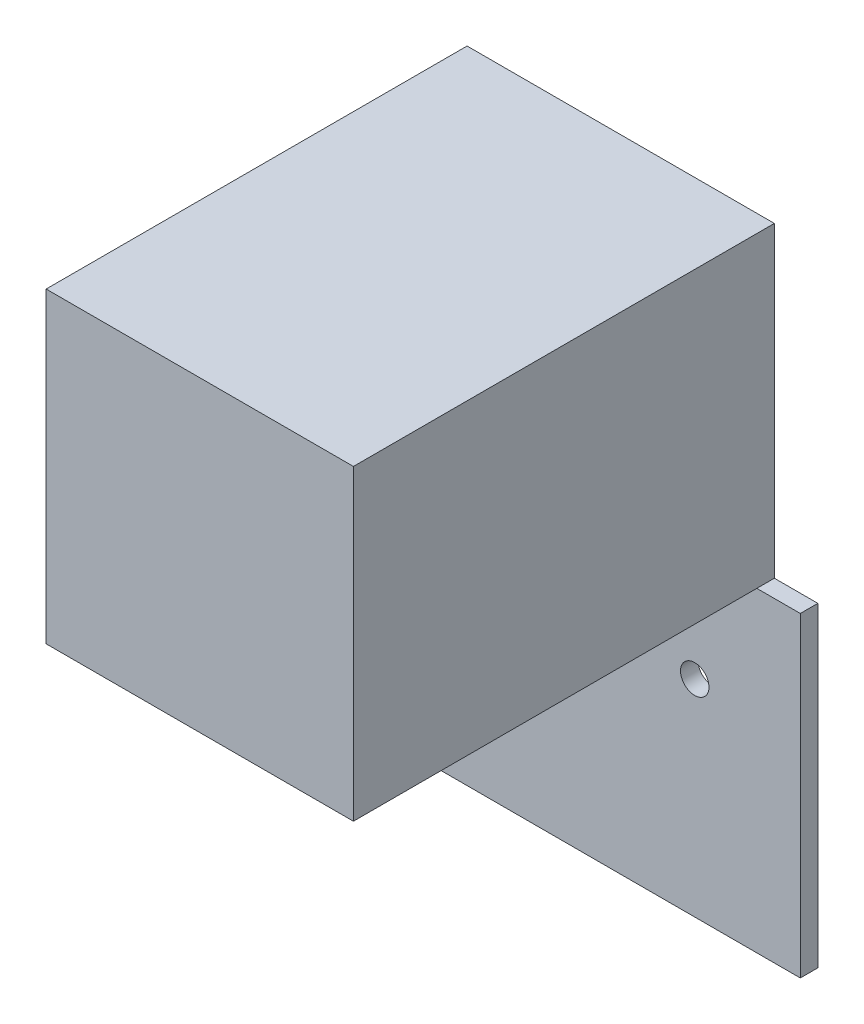
ISO-10303-21;
HEADER;
FILE_DESCRIPTION(('STEP AP214'),'2;1');
FILE_NAME('part.step','',(''),(''),'','','');
FILE_SCHEMA(('AUTOMOTIVE_DESIGN { 1 0 10303 214 1 1 1 1 }'));
ENDSEC;
DATA;
#1=APPLICATION_CONTEXT('core data for automotive mechanical design processes');
#2=APPLICATION_PROTOCOL_DEFINITION('international standard','automotive_design',2000,#1);
#3=PRODUCT_CONTEXT('',#1,'mechanical');
#4=PRODUCT('Part','Part','',(#3));
#5=PRODUCT_RELATED_PRODUCT_CATEGORY('part','',(#4));
#6=PRODUCT_DEFINITION_FORMATION('','',#4);
#7=PRODUCT_DEFINITION_CONTEXT('part definition',#1,'design');
#8=PRODUCT_DEFINITION('design','',#6,#7);
#9=PRODUCT_DEFINITION_SHAPE('','',#8);
#10=(LENGTH_UNIT() NAMED_UNIT(*) SI_UNIT(.MILLI.,.METRE.));
#11=(NAMED_UNIT(*) PLANE_ANGLE_UNIT() SI_UNIT($,.RADIAN.));
#12=(NAMED_UNIT(*) SI_UNIT($,.STERADIAN.) SOLID_ANGLE_UNIT());
#13=UNCERTAINTY_MEASURE_WITH_UNIT(LENGTH_MEASURE(1.E-05),#10,'distance_accuracy_value','');
#14=(GEOMETRIC_REPRESENTATION_CONTEXT(3) GLOBAL_UNCERTAINTY_ASSIGNED_CONTEXT((#13)) GLOBAL_UNIT_ASSIGNED_CONTEXT((#10,
#11,#12)) REPRESENTATION_CONTEXT('',''));
#15=CARTESIAN_POINT('',(0.,0.,0.));
#16=DIRECTION('',(0.,0.,1.));
#17=DIRECTION('',(1.,0.,0.));
#18=AXIS2_PLACEMENT_3D('',#15,#16,#17);
#19=CARTESIAN_POINT('',(0.,114.3,6.35));
#20=DIRECTION('',(0.,-1.,0.));
#21=DIRECTION('',(0.,0.,-1.));
#22=AXIS2_PLACEMENT_3D('',#19,#20,#21);
#23=PLANE('',#22);
#24=DIRECTION('',(0.,0.,-1.));
#25=VECTOR('',#24,1.);
#26=CARTESIAN_POINT('',(159.004,114.3,152.4));
#27=LINE('',#26,#25);
#28=CARTESIAN_POINT('',(159.004,114.3,6.34999999999999));
#29=VERTEX_POINT('',#28);
#30=CARTESIAN_POINT('',(159.004,114.3,0.));
#31=VERTEX_POINT('',#30);
#32=EDGE_CURVE('E11',#29,#31,#27,.T.);
#33=ORIENTED_EDGE('',*,*,#32,.F.);
#34=DIRECTION('',(-1.,0.,0.));
#35=VECTOR('',#34,1.);
#36=CARTESIAN_POINT('',(0.,114.3,6.35));
#37=LINE('',#36,#35);
#38=CARTESIAN_POINT('',(174.752,114.3,6.35));
#39=VERTEX_POINT('',#38);
#40=EDGE_CURVE('E161',#39,#29,#37,.T.);
#41=ORIENTED_EDGE('',*,*,#40,.F.);
#42=DIRECTION('',(0.,0.,-1.));
#43=VECTOR('',#42,1.);
#44=CARTESIAN_POINT('',(174.752,114.3,6.35));
#45=LINE('',#44,#43);
#46=CARTESIAN_POINT('',(174.752,114.3,0.));
#47=VERTEX_POINT('',#46);
#48=EDGE_CURVE('E152',#39,#47,#45,.T.);
#49=ORIENTED_EDGE('',*,*,#48,.T.);
#50=DIRECTION('',(-1.,0.,0.));
#51=VECTOR('',#50,1.);
#52=CARTESIAN_POINT('',(0.,114.3,0.));
#53=LINE('',#52,#51);
#54=EDGE_CURVE('E162',#47,#31,#53,.T.);
#55=ORIENTED_EDGE('',*,*,#54,.T.);
#56=EDGE_LOOP('',(#33,#41,#49,#55));
#57=FACE_BOUND('',#56,.T.);
#58=ADVANCED_FACE('F39',(#57),#23,.F.);
#59=CARTESIAN_POINT('',(0.,0.,6.35));
#60=DIRECTION('',(1.,0.,0.));
#61=DIRECTION('',(0.,0.,-1.));
#62=AXIS2_PLACEMENT_3D('',#59,#60,#61);
#63=PLANE('',#62);
#64=DIRECTION('',(0.,-1.,0.));
#65=VECTOR('',#64,1.);
#66=CARTESIAN_POINT('',(0.,0.,0.));
#67=LINE('',#66,#65);
#68=CARTESIAN_POINT('',(0.,114.3,0.));
#69=VERTEX_POINT('',#68);
#70=CARTESIAN_POINT('',(0.,0.,0.));
#71=VERTEX_POINT('',#70);
#72=EDGE_CURVE('E142',#69,#71,#67,.T.);
#73=ORIENTED_EDGE('',*,*,#72,.T.);
#74=DIRECTION('',(0.,0.,-1.));
#75=VECTOR('',#74,1.);
#76=CARTESIAN_POINT('',(0.,0.,6.35));
#77=LINE('',#76,#75);
#78=CARTESIAN_POINT('',(0.,0.,6.35));
#79=VERTEX_POINT('',#78);
#80=EDGE_CURVE('E43',#79,#71,#77,.T.);
#81=ORIENTED_EDGE('',*,*,#80,.F.);
#82=DIRECTION('',(0.,-1.,0.));
#83=VECTOR('',#82,1.);
#84=CARTESIAN_POINT('',(0.,0.,6.35));
#85=LINE('',#84,#83);
#86=CARTESIAN_POINT('',(0.,114.3,6.35));
#87=VERTEX_POINT('',#86);
#88=EDGE_CURVE('E165',#87,#79,#85,.T.);
#89=ORIENTED_EDGE('',*,*,#88,.F.);
#90=DIRECTION('',(0.,0.,-1.));
#91=VECTOR('',#90,1.);
#92=CARTESIAN_POINT('',(0.,114.3,6.35));
#93=LINE('',#92,#91);
#94=EDGE_CURVE('E157',#87,#69,#93,.T.);
#95=ORIENTED_EDGE('',*,*,#94,.T.);
#96=EDGE_LOOP('',(#73,#81,#89,#95));
#97=FACE_BOUND('',#96,.T.);
#98=ADVANCED_FACE('F41',(#97),#63,.F.);
#99=CARTESIAN_POINT('',(0.,0.,6.35));
#100=DIRECTION('',(0.,1.,0.));
#101=DIRECTION('',(0.,0.,1.));
#102=AXIS2_PLACEMENT_3D('',#99,#100,#101);
#103=PLANE('',#102);
#104=DIRECTION('',(1.,0.,0.));
#105=VECTOR('',#104,1.);
#106=CARTESIAN_POINT('',(0.,0.,0.));
#107=LINE('',#106,#105);
#108=CARTESIAN_POINT('',(174.752,0.,0.));
#109=VERTEX_POINT('',#108);
#110=EDGE_CURVE('E145',#71,#109,#107,.T.);
#111=ORIENTED_EDGE('',*,*,#110,.T.);
#112=DIRECTION('',(0.,0.,-1.));
#113=VECTOR('',#112,1.);
#114=CARTESIAN_POINT('',(174.752,0.,6.35));
#115=LINE('',#114,#113);
#116=CARTESIAN_POINT('',(174.752,0.,6.35));
#117=VERTEX_POINT('',#116);
#118=EDGE_CURVE('E149',#117,#109,#115,.T.);
#119=ORIENTED_EDGE('',*,*,#118,.F.);
#120=DIRECTION('',(1.,0.,0.));
#121=VECTOR('',#120,1.);
#122=CARTESIAN_POINT('',(0.,0.,6.35));
#123=LINE('',#122,#121);
#124=EDGE_CURVE('E95',#79,#117,#123,.T.);
#125=ORIENTED_EDGE('',*,*,#124,.F.);
#126=ORIENTED_EDGE('',*,*,#80,.T.);
#127=EDGE_LOOP('',(#111,#119,#125,#126));
#128=FACE_BOUND('',#127,.T.);
#129=ADVANCED_FACE('F181',(#128),#103,.F.);
#130=CARTESIAN_POINT('',(174.752,0.,6.35));
#131=DIRECTION('',(-1.,0.,0.));
#132=DIRECTION('',(0.,0.,1.));
#133=AXIS2_PLACEMENT_3D('',#130,#131,#132);
#134=PLANE('',#133);
#135=DIRECTION('',(0.,1.,0.));
#136=VECTOR('',#135,1.);
#137=CARTESIAN_POINT('',(174.752,0.,0.));
#138=LINE('',#137,#136);
#139=EDGE_CURVE('E166',#109,#47,#138,.T.);
#140=ORIENTED_EDGE('',*,*,#139,.T.);
#141=ORIENTED_EDGE('',*,*,#48,.F.);
#142=DIRECTION('',(0.,1.,0.));
#143=VECTOR('',#142,1.);
#144=CARTESIAN_POINT('',(174.752,0.,6.35));
#145=LINE('',#144,#143);
#146=EDGE_CURVE('E172',#117,#39,#145,.T.);
#147=ORIENTED_EDGE('',*,*,#146,.F.);
#148=ORIENTED_EDGE('',*,*,#118,.T.);
#149=EDGE_LOOP('',(#140,#141,#147,#148));
#150=FACE_BOUND('',#149,.T.);
#151=ADVANCED_FACE('F183',(#150),#134,.F.);
#152=CARTESIAN_POINT('',(47.752,114.3,6.34999999999999));
#153=VERTEX_POINT('',#152);
#154=EDGE_CURVE('E66',#153,#87,#37,.T.);
#155=ORIENTED_EDGE('',*,*,#154,.F.);
#156=DIRECTION('',(0.,0.,-1.));
#157=VECTOR('',#156,1.);
#158=CARTESIAN_POINT('',(47.752,114.3,152.4));
#159=LINE('',#158,#157);
#160=CARTESIAN_POINT('',(47.752,114.3,0.));
#161=VERTEX_POINT('',#160);
#162=EDGE_CURVE('E48',#153,#161,#159,.T.);
#163=ORIENTED_EDGE('',*,*,#162,.T.);
#164=EDGE_CURVE('E87',#161,#69,#53,.T.);
#165=ORIENTED_EDGE('',*,*,#164,.T.);
#166=ORIENTED_EDGE('',*,*,#94,.F.);
#167=EDGE_LOOP('',(#155,#163,#165,#166));
#168=FACE_BOUND('',#167,.T.);
#169=ADVANCED_FACE('F229',(#168),#23,.F.);
#170=CARTESIAN_POINT('',(0.,0.,6.35));
#171=DIRECTION('',(0.,0.,-1.));
#172=DIRECTION('',(-1.,0.,0.));
#173=AXIS2_PLACEMENT_3D('',#170,#171,#172);
#174=PLANE('',#173);
#175=CARTESIAN_POINT('',(73.025,74.6252,6.34999999999999));
#176=DIRECTION('',(0.,0.,-1.));
#177=DIRECTION('',(-1.,0.,0.));
#178=AXIS2_PLACEMENT_3D('',#175,#176,#177);
#179=CIRCLE('',#178,5.1562);
#180=CARTESIAN_POINT('',(67.8688,74.6252,6.34999999999999));
#181=VERTEX_POINT('',#180);
#182=EDGE_CURVE('E196',#181,#181,#179,.F.);
#183=ORIENTED_EDGE('',*,*,#182,.F.);
#184=EDGE_LOOP('',(#183));
#185=FACE_BOUND('',#184,.T.);
#186=CARTESIAN_POINT('',(136.525,74.6252,6.34999999999999));
#187=DIRECTION('',(0.,0.,-1.));
#188=DIRECTION('',(-1.,0.,0.));
#189=AXIS2_PLACEMENT_3D('',#186,#187,#188);
#190=CIRCLE('',#189,5.1562);
#191=CARTESIAN_POINT('',(131.3688,74.6252,6.34999999999999));
#192=VERTEX_POINT('',#191);
#193=EDGE_CURVE('E208',#192,#192,#190,.F.);
#194=ORIENTED_EDGE('',*,*,#193,.F.);
#195=EDGE_LOOP('',(#194));
#196=FACE_BOUND('',#195,.T.);
#197=ORIENTED_EDGE('',*,*,#88,.T.);
#198=ORIENTED_EDGE('',*,*,#124,.T.);
#199=ORIENTED_EDGE('',*,*,#146,.T.);
#200=ORIENTED_EDGE('',*,*,#40,.T.);
#201=EDGE_CURVE('E171',#29,#153,#37,.T.);
#202=ORIENTED_EDGE('',*,*,#201,.T.);
#203=ORIENTED_EDGE('',*,*,#154,.T.);
#204=EDGE_LOOP('',(#197,#198,#199,#200,#202,#203));
#205=FACE_BOUND('',#204,.T.);
#206=ADVANCED_FACE('F175',(#185,#196,#205),#174,.F.);
#207=CARTESIAN_POINT('',(0.,0.,0.));
#208=DIRECTION('',(0.,0.,-1.));
#209=DIRECTION('',(-1.,0.,0.));
#210=AXIS2_PLACEMENT_3D('',#207,#208,#209);
#211=PLANE('',#210);
#212=CARTESIAN_POINT('',(73.025,74.6252,0.));
#213=DIRECTION('',(0.,0.,1.));
#214=DIRECTION('',(1.,0.,0.));
#215=AXIS2_PLACEMENT_3D('',#212,#213,#214);
#216=CIRCLE('',#215,5.1562);
#217=CARTESIAN_POINT('',(78.1812,74.6252,0.));
#218=VERTEX_POINT('',#217);
#219=EDGE_CURVE('E211',#218,#218,#216,.T.);
#220=ORIENTED_EDGE('',*,*,#219,.T.);
#221=EDGE_LOOP('',(#220));
#222=FACE_BOUND('',#221,.T.);
#223=CARTESIAN_POINT('',(136.525,74.6252,0.));
#224=DIRECTION('',(0.,0.,1.));
#225=DIRECTION('',(1.,0.,0.));
#226=AXIS2_PLACEMENT_3D('',#223,#224,#225);
#227=CIRCLE('',#226,5.1562);
#228=CARTESIAN_POINT('',(141.6812,74.6252,0.));
#229=VERTEX_POINT('',#228);
#230=EDGE_CURVE('E212',#229,#229,#227,.T.);
#231=ORIENTED_EDGE('',*,*,#230,.T.);
#232=EDGE_LOOP('',(#231));
#233=FACE_BOUND('',#232,.T.);
#234=ORIENTED_EDGE('',*,*,#72,.F.);
#235=ORIENTED_EDGE('',*,*,#164,.F.);
#236=DIRECTION('',(0.,-1.,0.));
#237=VECTOR('',#236,1.);
#238=CARTESIAN_POINT('',(47.752,114.3,0.));
#239=LINE('',#238,#237);
#240=CARTESIAN_POINT('',(47.752,225.552,0.));
#241=VERTEX_POINT('',#240);
#242=EDGE_CURVE('E57',#241,#161,#239,.T.);
#243=ORIENTED_EDGE('',*,*,#242,.F.);
#244=DIRECTION('',(-1.,0.,0.));
#245=VECTOR('',#244,1.);
#246=CARTESIAN_POINT('',(47.752,225.552,0.));
#247=LINE('',#246,#245);
#248=CARTESIAN_POINT('',(159.004,225.552,0.));
#249=VERTEX_POINT('',#248);
#250=EDGE_CURVE('E139',#249,#241,#247,.T.);
#251=ORIENTED_EDGE('',*,*,#250,.F.);
#252=DIRECTION('',(0.,1.,0.));
#253=VECTOR('',#252,1.);
#254=CARTESIAN_POINT('',(159.004,114.3,0.));
#255=LINE('',#254,#253);
#256=EDGE_CURVE('E191',#31,#249,#255,.T.);
#257=ORIENTED_EDGE('',*,*,#256,.F.);
#258=ORIENTED_EDGE('',*,*,#54,.F.);
#259=ORIENTED_EDGE('',*,*,#139,.F.);
#260=ORIENTED_EDGE('',*,*,#110,.F.);
#261=EDGE_LOOP('',(#234,#235,#243,#251,#257,#258,#259,#260));
#262=FACE_BOUND('',#261,.T.);
#263=ADVANCED_FACE('F179',(#222,#233,#262),#211,.T.);
#264=CARTESIAN_POINT('',(47.752,114.3,152.4));
#265=DIRECTION('',(1.,0.,0.));
#266=DIRECTION('',(0.,0.,-1.));
#267=AXIS2_PLACEMENT_3D('',#264,#265,#266);
#268=PLANE('',#267);
#269=ORIENTED_EDGE('',*,*,#242,.T.);
#270=ORIENTED_EDGE('',*,*,#162,.F.);
#271=CARTESIAN_POINT('',(47.752,114.3,152.4));
#272=VERTEX_POINT('',#271);
#273=EDGE_CURVE('E127',#272,#153,#159,.T.);
#274=ORIENTED_EDGE('',*,*,#273,.F.);
#275=DIRECTION('',(0.,-1.,0.));
#276=VECTOR('',#275,1.);
#277=CARTESIAN_POINT('',(47.752,114.3,152.4));
#278=LINE('',#277,#276);
#279=CARTESIAN_POINT('',(47.752,225.552,152.4));
#280=VERTEX_POINT('',#279);
#281=EDGE_CURVE('E132',#280,#272,#278,.T.);
#282=ORIENTED_EDGE('',*,*,#281,.F.);
#283=DIRECTION('',(0.,0.,-1.));
#284=VECTOR('',#283,1.);
#285=CARTESIAN_POINT('',(47.752,225.552,152.4));
#286=LINE('',#285,#284);
#287=EDGE_CURVE('E200',#280,#241,#286,.T.);
#288=ORIENTED_EDGE('',*,*,#287,.T.);
#289=EDGE_LOOP('',(#269,#270,#274,#282,#288));
#290=FACE_BOUND('',#289,.T.);
#291=ADVANCED_FACE('F141',(#290),#268,.F.);
#292=CARTESIAN_POINT('',(47.752,114.3,152.4));
#293=DIRECTION('',(0.,1.,0.));
#294=DIRECTION('',(0.,0.,1.));
#295=AXIS2_PLACEMENT_3D('',#292,#293,#294);
#296=PLANE('',#295);
#297=ORIENTED_EDGE('',*,*,#201,.F.);
#298=CARTESIAN_POINT('',(159.004,114.3,152.4));
#299=VERTEX_POINT('',#298);
#300=EDGE_CURVE('E50',#299,#29,#27,.T.);
#301=ORIENTED_EDGE('',*,*,#300,.F.);
#302=DIRECTION('',(1.,0.,0.));
#303=VECTOR('',#302,1.);
#304=CARTESIAN_POINT('',(47.752,114.3,152.4));
#305=LINE('',#304,#303);
#306=EDGE_CURVE('E123',#272,#299,#305,.T.);
#307=ORIENTED_EDGE('',*,*,#306,.F.);
#308=ORIENTED_EDGE('',*,*,#273,.T.);
#309=EDGE_LOOP('',(#297,#301,#307,#308));
#310=FACE_BOUND('',#309,.T.);
#311=ADVANCED_FACE('F125',(#310),#296,.F.);
#312=CARTESIAN_POINT('',(159.004,114.3,152.4));
#313=DIRECTION('',(-1.,0.,0.));
#314=DIRECTION('',(0.,0.,1.));
#315=AXIS2_PLACEMENT_3D('',#312,#313,#314);
#316=PLANE('',#315);
#317=ORIENTED_EDGE('',*,*,#256,.T.);
#318=DIRECTION('',(0.,0.,-1.));
#319=VECTOR('',#318,1.);
#320=CARTESIAN_POINT('',(159.004,225.552,152.4));
#321=LINE('',#320,#319);
#322=CARTESIAN_POINT('',(159.004,225.552,152.4));
#323=VERTEX_POINT('',#322);
#324=EDGE_CURVE('E147',#323,#249,#321,.T.);
#325=ORIENTED_EDGE('',*,*,#324,.F.);
#326=DIRECTION('',(0.,1.,0.));
#327=VECTOR('',#326,1.);
#328=CARTESIAN_POINT('',(159.004,114.3,152.4));
#329=LINE('',#328,#327);
#330=EDGE_CURVE('E131',#299,#323,#329,.T.);
#331=ORIENTED_EDGE('',*,*,#330,.F.);
#332=ORIENTED_EDGE('',*,*,#300,.T.);
#333=ORIENTED_EDGE('',*,*,#32,.T.);
#334=EDGE_LOOP('',(#317,#325,#331,#332,#333));
#335=FACE_BOUND('',#334,.T.);
#336=ADVANCED_FACE('F189',(#335),#316,.F.);
#337=CARTESIAN_POINT('',(47.752,225.552,152.4));
#338=DIRECTION('',(0.,-1.,0.));
#339=DIRECTION('',(0.,0.,-1.));
#340=AXIS2_PLACEMENT_3D('',#337,#338,#339);
#341=PLANE('',#340);
#342=ORIENTED_EDGE('',*,*,#250,.T.);
#343=ORIENTED_EDGE('',*,*,#287,.F.);
#344=DIRECTION('',(-1.,0.,0.));
#345=VECTOR('',#344,1.);
#346=CARTESIAN_POINT('',(47.752,225.552,152.4));
#347=LINE('',#346,#345);
#348=EDGE_CURVE('E137',#323,#280,#347,.T.);
#349=ORIENTED_EDGE('',*,*,#348,.F.);
#350=ORIENTED_EDGE('',*,*,#324,.T.);
#351=EDGE_LOOP('',(#342,#343,#349,#350));
#352=FACE_BOUND('',#351,.T.);
#353=ADVANCED_FACE('F203',(#352),#341,.F.);
#354=CARTESIAN_POINT('',(0.,0.,152.4));
#355=DIRECTION('',(0.,0.,-1.));
#356=DIRECTION('',(-1.,0.,0.));
#357=AXIS2_PLACEMENT_3D('',#354,#355,#356);
#358=PLANE('',#357);
#359=ORIENTED_EDGE('',*,*,#281,.T.);
#360=ORIENTED_EDGE('',*,*,#306,.T.);
#361=ORIENTED_EDGE('',*,*,#330,.T.);
#362=ORIENTED_EDGE('',*,*,#348,.T.);
#363=EDGE_LOOP('',(#359,#360,#361,#362));
#364=FACE_BOUND('',#363,.T.);
#365=ADVANCED_FACE('F135',(#364),#358,.F.);
#366=CARTESIAN_POINT('',(136.525,74.6252,152.4));
#367=DIRECTION('',(0.,0.,-1.));
#368=DIRECTION('',(-1.,0.,0.));
#369=AXIS2_PLACEMENT_3D('',#366,#367,#368);
#370=CYLINDRICAL_SURFACE('',#369,5.1562);
#371=ORIENTED_EDGE('',*,*,#230,.F.);
#372=EDGE_LOOP('',(#371));
#373=FACE_BOUND('',#372,.T.);
#374=ORIENTED_EDGE('',*,*,#193,.T.);
#375=EDGE_LOOP('',(#374));
#376=FACE_BOUND('',#375,.T.);
#377=ADVANCED_FACE('F223',(#373,#376),#370,.F.);
#378=CARTESIAN_POINT('',(73.025,74.6252,152.4));
#379=DIRECTION('',(0.,0.,-1.));
#380=DIRECTION('',(-1.,0.,0.));
#381=AXIS2_PLACEMENT_3D('',#378,#379,#380);
#382=CYLINDRICAL_SURFACE('',#381,5.1562);
#383=ORIENTED_EDGE('',*,*,#219,.F.);
#384=EDGE_LOOP('',(#383));
#385=FACE_BOUND('',#384,.T.);
#386=ORIENTED_EDGE('',*,*,#182,.T.);
#387=EDGE_LOOP('',(#386));
#388=FACE_BOUND('',#387,.T.);
#389=ADVANCED_FACE('F220',(#385,#388),#382,.F.);
#390=CLOSED_SHELL('',(#58,#98,#129,#151,#169,#206,#263,#291,#311,#336,#353,#365,#377,#389));
#391=MANIFOLD_SOLID_BREP('B2',#390);
#392=ADVANCED_BREP_SHAPE_REPRESENTATION('',(#18,#391),#14);
#393=SHAPE_DEFINITION_REPRESENTATION(#9,#392);
ENDSEC;
END-ISO-10303-21;
